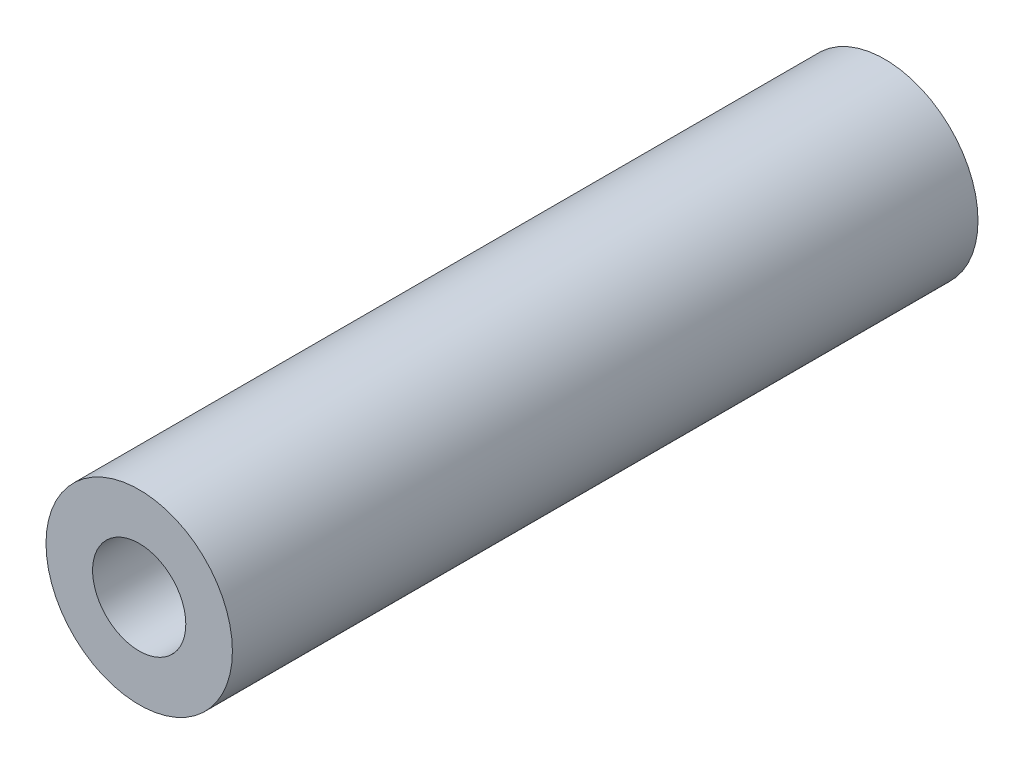
ISO-10303-21;
HEADER;
FILE_DESCRIPTION(('STEP AP214'),'2;1');
FILE_NAME('part.step','',(''),(''),'','','');
FILE_SCHEMA(('AUTOMOTIVE_DESIGN { 1 0 10303 214 1 1 1 1 }'));
ENDSEC;
DATA;
#1=APPLICATION_CONTEXT('core data for automotive mechanical design processes');
#2=APPLICATION_PROTOCOL_DEFINITION('international standard','automotive_design',2000,#1);
#3=PRODUCT_CONTEXT('',#1,'mechanical');
#4=PRODUCT('Part','Part','',(#3));
#5=PRODUCT_RELATED_PRODUCT_CATEGORY('part','',(#4));
#6=PRODUCT_DEFINITION_FORMATION('','',#4);
#7=PRODUCT_DEFINITION_CONTEXT('part definition',#1,'design');
#8=PRODUCT_DEFINITION('design','',#6,#7);
#9=PRODUCT_DEFINITION_SHAPE('','',#8);
#10=(LENGTH_UNIT() NAMED_UNIT(*) SI_UNIT(.MILLI.,.METRE.));
#11=(NAMED_UNIT(*) PLANE_ANGLE_UNIT() SI_UNIT($,.RADIAN.));
#12=(NAMED_UNIT(*) SI_UNIT($,.STERADIAN.) SOLID_ANGLE_UNIT());
#13=UNCERTAINTY_MEASURE_WITH_UNIT(LENGTH_MEASURE(1.E-05),#10,'distance_accuracy_value','');
#14=(GEOMETRIC_REPRESENTATION_CONTEXT(3) GLOBAL_UNCERTAINTY_ASSIGNED_CONTEXT((#13)) GLOBAL_UNIT_ASSIGNED_CONTEXT((#10,
#11,#12)) REPRESENTATION_CONTEXT('',''));
#15=CARTESIAN_POINT('',(0.,0.,0.));
#16=DIRECTION('',(0.,0.,1.));
#17=DIRECTION('',(1.,0.,0.));
#18=AXIS2_PLACEMENT_3D('',#15,#16,#17);
#19=CARTESIAN_POINT('',(0.,0.,-12.7));
#20=DIRECTION('',(0.,0.,1.));
#21=DIRECTION('',(1.,0.,0.));
#22=AXIS2_PLACEMENT_3D('',#19,#20,#21);
#23=CYLINDRICAL_SURFACE('',#22,3.175);
#24=CARTESIAN_POINT('',(0.,0.,-12.7));
#25=DIRECTION('',(0.,0.,1.));
#26=DIRECTION('',(1.,0.,0.));
#27=AXIS2_PLACEMENT_3D('',#24,#25,#26);
#28=CIRCLE('',#27,3.175);
#29=CARTESIAN_POINT('',(3.175,0.,-12.7));
#30=VERTEX_POINT('',#29);
#31=EDGE_CURVE('E10',#30,#30,#28,.T.);
#32=ORIENTED_EDGE('',*,*,#31,.T.);
#33=EDGE_LOOP('',(#32));
#34=FACE_BOUND('',#33,.T.);
#35=CARTESIAN_POINT('',(0.,0.,12.7));
#36=DIRECTION('',(0.,0.,1.));
#37=DIRECTION('',(1.,0.,0.));
#38=AXIS2_PLACEMENT_3D('',#35,#36,#37);
#39=CIRCLE('',#38,3.175);
#40=CARTESIAN_POINT('',(3.175,0.,12.7));
#41=VERTEX_POINT('',#40);
#42=EDGE_CURVE('E40',#41,#41,#39,.T.);
#43=ORIENTED_EDGE('',*,*,#42,.F.);
#44=EDGE_LOOP('',(#43));
#45=FACE_BOUND('',#44,.T.);
#46=ADVANCED_FACE('F34',(#34,#45),#23,.T.);
#47=CARTESIAN_POINT('',(0.,0.,-12.7));
#48=DIRECTION('',(0.,0.,1.));
#49=DIRECTION('',(1.,0.,0.));
#50=AXIS2_PLACEMENT_3D('',#47,#48,#49);
#51=PLANE('',#50);
#52=CARTESIAN_POINT('',(0.,0.,-12.7));
#53=DIRECTION('',(0.,0.,1.));
#54=DIRECTION('',(1.,0.,0.));
#55=AXIS2_PLACEMENT_3D('',#52,#53,#54);
#56=CIRCLE('',#55,1.5875);
#57=CARTESIAN_POINT('',(1.5875,0.,-12.7));
#58=VERTEX_POINT('',#57);
#59=EDGE_CURVE('E44',#58,#58,#56,.T.);
#60=ORIENTED_EDGE('',*,*,#59,.T.);
#61=EDGE_LOOP('',(#60));
#62=FACE_BOUND('',#61,.T.);
#63=ORIENTED_EDGE('',*,*,#31,.F.);
#64=EDGE_LOOP('',(#63));
#65=FACE_BOUND('',#64,.T.);
#66=ADVANCED_FACE('F58',(#62,#65),#51,.F.);
#67=CARTESIAN_POINT('',(0.,0.,12.7));
#68=DIRECTION('',(0.,0.,1.));
#69=DIRECTION('',(1.,0.,0.));
#70=AXIS2_PLACEMENT_3D('',#67,#68,#69);
#71=PLANE('',#70);
#72=CARTESIAN_POINT('',(0.,0.,12.7));
#73=DIRECTION('',(0.,0.,1.));
#74=DIRECTION('',(1.,0.,0.));
#75=AXIS2_PLACEMENT_3D('',#72,#73,#74);
#76=CIRCLE('',#75,1.5875);
#77=CARTESIAN_POINT('',(1.5875,0.,12.7));
#78=VERTEX_POINT('',#77);
#79=EDGE_CURVE('E48',#78,#78,#76,.T.);
#80=ORIENTED_EDGE('',*,*,#79,.F.);
#81=EDGE_LOOP('',(#80));
#82=FACE_BOUND('',#81,.T.);
#83=ORIENTED_EDGE('',*,*,#42,.T.);
#84=EDGE_LOOP('',(#83));
#85=FACE_BOUND('',#84,.T.);
#86=ADVANCED_FACE('F56',(#82,#85),#71,.T.);
#87=CARTESIAN_POINT('',(0.,0.,-12.7));
#88=DIRECTION('',(0.,0.,1.));
#89=DIRECTION('',(1.,0.,0.));
#90=AXIS2_PLACEMENT_3D('',#87,#88,#89);
#91=CYLINDRICAL_SURFACE('',#90,1.5875);
#92=ORIENTED_EDGE('',*,*,#59,.F.);
#93=EDGE_LOOP('',(#92));
#94=FACE_BOUND('',#93,.T.);
#95=ORIENTED_EDGE('',*,*,#79,.T.);
#96=EDGE_LOOP('',(#95));
#97=FACE_BOUND('',#96,.T.);
#98=ADVANCED_FACE('F54',(#94,#97),#91,.F.);
#99=CLOSED_SHELL('',(#46,#66,#86,#98));
#100=MANIFOLD_SOLID_BREP('B2',#99);
#101=ADVANCED_BREP_SHAPE_REPRESENTATION('',(#18,#100),#14);
#102=SHAPE_DEFINITION_REPRESENTATION(#9,#101);
ENDSEC;
END-ISO-10303-21;
